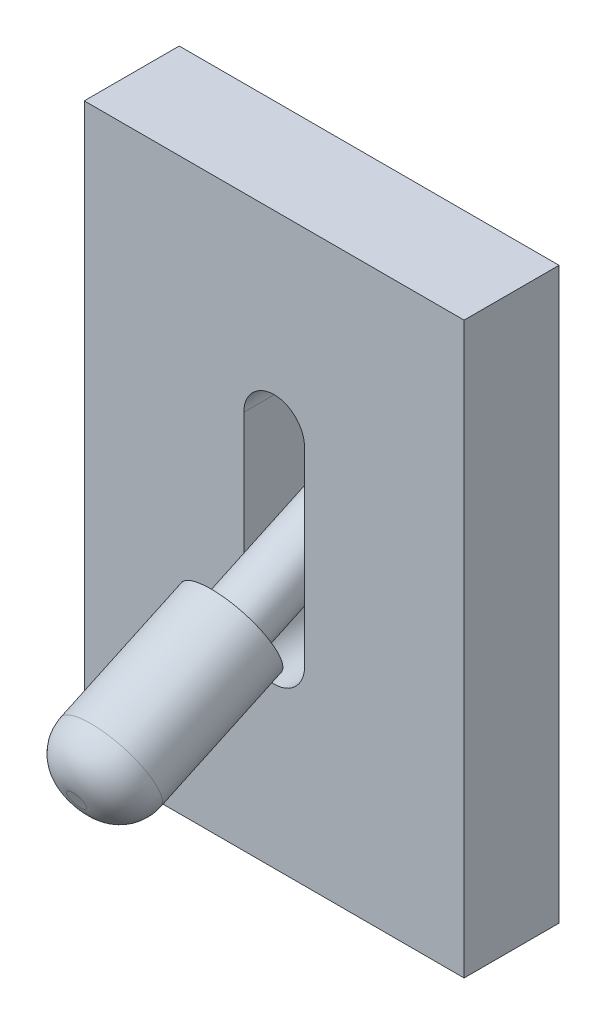
ISO-10303-21;
HEADER;
FILE_DESCRIPTION(('STEP AP214'),'2;1');
FILE_NAME('part.step','',(''),(''),'','','');
FILE_SCHEMA(('AUTOMOTIVE_DESIGN { 1 0 10303 214 1 1 1 1 }'));
ENDSEC;
DATA;
#1=APPLICATION_CONTEXT('core data for automotive mechanical design processes');
#2=APPLICATION_PROTOCOL_DEFINITION('international standard','automotive_design',2000,#1);
#3=PRODUCT_CONTEXT('',#1,'mechanical');
#4=PRODUCT('Part','Part','',(#3));
#5=PRODUCT_RELATED_PRODUCT_CATEGORY('part','',(#4));
#6=PRODUCT_DEFINITION_FORMATION('','',#4);
#7=PRODUCT_DEFINITION_CONTEXT('part definition',#1,'design');
#8=PRODUCT_DEFINITION('design','',#6,#7);
#9=PRODUCT_DEFINITION_SHAPE('','',#8);
#10=(LENGTH_UNIT() NAMED_UNIT(*) SI_UNIT(.MILLI.,.METRE.));
#11=(NAMED_UNIT(*) PLANE_ANGLE_UNIT() SI_UNIT($,.RADIAN.));
#12=(NAMED_UNIT(*) SI_UNIT($,.STERADIAN.) SOLID_ANGLE_UNIT());
#13=UNCERTAINTY_MEASURE_WITH_UNIT(LENGTH_MEASURE(1.E-05),#10,'distance_accuracy_value','');
#14=(GEOMETRIC_REPRESENTATION_CONTEXT(3) GLOBAL_UNCERTAINTY_ASSIGNED_CONTEXT((#13)) GLOBAL_UNIT_ASSIGNED_CONTEXT((#10,
#11,#12)) REPRESENTATION_CONTEXT('',''));
#15=CARTESIAN_POINT('',(0.,0.,0.));
#16=DIRECTION('',(0.,0.,1.));
#17=DIRECTION('',(1.,0.,0.));
#18=AXIS2_PLACEMENT_3D('',#15,#16,#17);
#19=CARTESIAN_POINT('',(-136.,-16.6845104495918,8.40723237962318));
#20=DIRECTION('',(0.,-0.422618261740694,0.906307787036653));
#21=DIRECTION('',(0.,-0.906307787036653,-0.422618261740694));
#22=AXIS2_PLACEMENT_3D('',#19,#20,#21);
#23=PLANE('',#22);
#24=CARTESIAN_POINT('',(-136.,-16.6845104495918,8.40723237962319));
#25=DIRECTION('',(0.,-0.422618261740694,0.906307787036653));
#26=DIRECTION('',(0.,-0.906307787036653,-0.422618261740694));
#27=AXIS2_PLACEMENT_3D('',#24,#25,#26);
#28=CIRCLE('',#27,0.499999999999985);
#29=CARTESIAN_POINT('',(-136.,-17.1376643431101,8.19592324875284));
#30=VERTEX_POINT('',#29);
#31=EDGE_CURVE('E11',#30,#30,#28,.T.);
#32=ORIENTED_EDGE('',*,*,#31,.T.);
#33=EDGE_LOOP('',(#32));
#34=FACE_BOUND('',#33,.T.);
#35=ADVANCED_FACE('F45',(#34),#23,.T.);
#36=CARTESIAN_POINT('',(-136.,-9.49999999999997,-7.00000000000001));
#37=DIRECTION('',(0.,0.422618261740694,-0.906307787036653));
#38=DIRECTION('',(0.,0.906307787036653,0.422618261740694));
#39=AXIS2_PLACEMENT_3D('',#36,#37,#38);
#40=CYLINDRICAL_SURFACE('',#39,2.49999999999999);
#41=CARTESIAN_POINT('',(-136.,-15.8392739261104,6.59461680554987));
#42=DIRECTION('',(0.,-0.422618261740694,0.906307787036653));
#43=DIRECTION('',(0.,-0.906307787036653,-0.422618261740694));
#44=AXIS2_PLACEMENT_3D('',#41,#42,#43);
#45=CIRCLE('',#44,2.49999999999999);
#46=CARTESIAN_POINT('',(-136.,-18.105043393702,5.53807115119814));
#47=VERTEX_POINT('',#46);
#48=EDGE_CURVE('E52',#47,#47,#45,.F.);
#49=ORIENTED_EDGE('',*,*,#48,.T.);
#50=EDGE_LOOP('',(#49));
#51=FACE_BOUND('',#50,.T.);
#52=CARTESIAN_POINT('',(-136.,-12.8809460939255,0.250462296293222));
#53=DIRECTION('',(0.,0.422618261740694,-0.906307787036653));
#54=DIRECTION('',(0.,0.906307787036653,0.422618261740694));
#55=AXIS2_PLACEMENT_3D('',#52,#53,#54);
#56=CIRCLE('',#55,2.49999999999998);
#57=CARTESIAN_POINT('',(-136.,-10.6151766263339,1.30700795064495));
#58=VERTEX_POINT('',#57);
#59=EDGE_CURVE('E56',#58,#58,#56,.T.);
#60=ORIENTED_EDGE('',*,*,#59,.F.);
#61=EDGE_LOOP('',(#60));
#62=FACE_BOUND('',#61,.T.);
#63=ADVANCED_FACE('F81',(#51,#62),#40,.T.);
#64=CARTESIAN_POINT('',(-136.,-10.6151766263339,1.30700795064495));
#65=DIRECTION('',(0.,0.422618261740694,-0.906307787036653));
#66=DIRECTION('',(0.,0.906307787036653,0.422618261740694));
#67=AXIS2_PLACEMENT_3D('',#64,#65,#66);
#68=PLANE('',#67);
#69=ORIENTED_EDGE('',*,*,#59,.T.);
#70=EDGE_LOOP('',(#69));
#71=FACE_BOUND('',#70,.T.);
#72=CARTESIAN_POINT('',(-136.,-12.8809460939255,0.250462296293216));
#73=DIRECTION('',(0.,0.422618261740694,-0.906307787036653));
#74=DIRECTION('',(0.,0.906307787036653,0.422618261740694));
#75=AXIS2_PLACEMENT_3D('',#72,#73,#74);
#76=CIRCLE('',#75,1.49999999999999);
#77=CARTESIAN_POINT('',(-136.,-11.5214844133706,0.884389688904253));
#78=VERTEX_POINT('',#77);
#79=EDGE_CURVE('E60',#78,#78,#76,.T.);
#80=ORIENTED_EDGE('',*,*,#79,.F.);
#81=EDGE_LOOP('',(#80));
#82=FACE_BOUND('',#81,.T.);
#83=ADVANCED_FACE('F73',(#71,#82),#68,.T.);
#84=CARTESIAN_POINT('',(-136.,-9.49999999999997,-7.00000000000001));
#85=DIRECTION('',(0.,0.422618261740694,-0.906307787036653));
#86=DIRECTION('',(0.,0.906307787036653,0.422618261740694));
#87=AXIS2_PLACEMENT_3D('',#84,#85,#86);
#88=CYLINDRICAL_SURFACE('',#87,1.49999999999999);
#89=ORIENTED_EDGE('',*,*,#79,.T.);
#90=EDGE_LOOP('',(#89));
#91=FACE_BOUND('',#90,.T.);
#92=CARTESIAN_POINT('',(-136.,-9.49999999999998,-6.99999999999998));
#93=DIRECTION('',(0.,0.422618261740694,-0.906307787036653));
#94=DIRECTION('',(0.,0.906307787036653,0.422618261740694));
#95=AXIS2_PLACEMENT_3D('',#92,#93,#94);
#96=CIRCLE('',#95,1.49999999999999);
#97=CARTESIAN_POINT('',(-136.,-8.14053831944501,-6.36607260738895));
#98=VERTEX_POINT('',#97);
#99=EDGE_CURVE('E65',#98,#98,#96,.T.);
#100=ORIENTED_EDGE('',*,*,#99,.F.);
#101=EDGE_LOOP('',(#100));
#102=FACE_BOUND('',#101,.T.);
#103=ADVANCED_FACE('F71',(#91,#102),#88,.T.);
#104=CARTESIAN_POINT('',(-136.,-8.140538319445,-6.36607260738896));
#105=DIRECTION('',(0.,0.422618261740694,-0.906307787036653));
#106=DIRECTION('',(0.,0.906307787036653,0.422618261740694));
#107=AXIS2_PLACEMENT_3D('',#104,#105,#106);
#108=PLANE('',#107);
#109=ORIENTED_EDGE('',*,*,#99,.T.);
#110=EDGE_LOOP('',(#109));
#111=FACE_BOUND('',#110,.T.);
#112=ADVANCED_FACE('F69',(#111),#108,.T.);
#113=CARTESIAN_POINT('',(-136.,-15.8392739261104,6.59461680554988));
#114=DIRECTION('',(0.,-0.422618261740694,0.906307787036653));
#115=DIRECTION('',(0.,-0.906307787036653,-0.422618261740694));
#116=AXIS2_PLACEMENT_3D('',#113,#114,#115);
#117=DEGENERATE_TOROIDAL_SURFACE('',#116,0.499999999999985,2.,.T.);
#118=ORIENTED_EDGE('',*,*,#31,.F.);
#119=EDGE_LOOP('',(#118));
#120=FACE_BOUND('',#119,.T.);
#121=ORIENTED_EDGE('',*,*,#48,.F.);
#122=EDGE_LOOP('',(#121));
#123=FACE_BOUND('',#122,.T.);
#124=ADVANCED_FACE('F47',(#120,#123),#117,.T.);
#125=CLOSED_SHELL('',(#35,#63,#83,#103,#112,#124));
#126=MANIFOLD_SOLID_BREP('B2',#125);
#127=CARTESIAN_POINT('',(-126.,-25.,-43.0555127546399));
#128=DIRECTION('',(-1.,0.,0.));
#129=DIRECTION('',(0.,0.,1.));
#130=AXIS2_PLACEMENT_3D('',#127,#128,#129);
#131=PLANE('',#130);
#132=DIRECTION('',(0.,-1.,0.));
#133=VECTOR('',#132,1.);
#134=CARTESIAN_POINT('',(-126.,-25.,-7.));
#135=LINE('',#134,#133);
#136=CARTESIAN_POINT('',(-126.,5.00000000000001,-7.));
#137=VERTEX_POINT('',#136);
#138=CARTESIAN_POINT('',(-126.,-25.,-7.));
#139=VERTEX_POINT('',#138);
#140=EDGE_CURVE('E148',#137,#139,#135,.T.);
#141=ORIENTED_EDGE('',*,*,#140,.F.);
#142=DIRECTION('',(0.,0.,1.));
#143=VECTOR('',#142,1.);
#144=CARTESIAN_POINT('',(-126.,5.00000000000001,-43.0555127546399));
#145=LINE('',#144,#143);
#146=CARTESIAN_POINT('',(-126.,5.00000000000001,-2.));
#147=VERTEX_POINT('',#146);
#148=EDGE_CURVE('E256',#137,#147,#145,.T.);
#149=ORIENTED_EDGE('',*,*,#148,.T.);
#150=DIRECTION('',(0.,-1.,0.));
#151=VECTOR('',#150,1.);
#152=CARTESIAN_POINT('',(-126.,-25.,-2.));
#153=LINE('',#152,#151);
#154=CARTESIAN_POINT('',(-126.,-25.,-2.));
#155=VERTEX_POINT('',#154);
#156=EDGE_CURVE('E210',#147,#155,#153,.T.);
#157=ORIENTED_EDGE('',*,*,#156,.T.);
#158=DIRECTION('',(0.,0.,1.));
#159=VECTOR('',#158,1.);
#160=CARTESIAN_POINT('',(-126.,-25.,-43.0555127546399));
#161=LINE('',#160,#159);
#162=EDGE_CURVE('E242',#139,#155,#161,.T.);
#163=ORIENTED_EDGE('',*,*,#162,.F.);
#164=EDGE_LOOP('',(#141,#149,#157,#163));
#165=FACE_BOUND('',#164,.T.);
#166=ADVANCED_FACE('F141',(#165),#131,.F.);
#167=CARTESIAN_POINT('',(-146.,-25.,-43.0555127546399));
#168=DIRECTION('',(0.,1.,0.));
#169=DIRECTION('',(-1.,0.,0.));
#170=AXIS2_PLACEMENT_3D('',#167,#168,#169);
#171=PLANE('',#170);
#172=DIRECTION('',(-1.,0.,0.));
#173=VECTOR('',#172,1.);
#174=CARTESIAN_POINT('',(-146.,-25.,-7.));
#175=LINE('',#174,#173);
#176=CARTESIAN_POINT('',(-146.,-25.,-7.));
#177=VERTEX_POINT('',#176);
#178=EDGE_CURVE('E241',#139,#177,#175,.T.);
#179=ORIENTED_EDGE('',*,*,#178,.F.);
#180=ORIENTED_EDGE('',*,*,#162,.T.);
#181=DIRECTION('',(-1.,0.,0.));
#182=VECTOR('',#181,1.);
#183=CARTESIAN_POINT('',(-146.,-25.,-2.));
#184=LINE('',#183,#182);
#185=CARTESIAN_POINT('',(-146.,-25.,-2.));
#186=VERTEX_POINT('',#185);
#187=EDGE_CURVE('E247',#155,#186,#184,.T.);
#188=ORIENTED_EDGE('',*,*,#187,.T.);
#189=DIRECTION('',(0.,0.,1.));
#190=VECTOR('',#189,1.);
#191=CARTESIAN_POINT('',(-146.,-25.,-43.0555127546399));
#192=LINE('',#191,#190);
#193=EDGE_CURVE('E260',#177,#186,#192,.T.);
#194=ORIENTED_EDGE('',*,*,#193,.F.);
#195=EDGE_LOOP('',(#179,#180,#188,#194));
#196=FACE_BOUND('',#195,.T.);
#197=ADVANCED_FACE('F265',(#196),#171,.F.);
#198=CARTESIAN_POINT('',(-146.,-25.,-43.0555127546399));
#199=DIRECTION('',(1.,0.,0.));
#200=DIRECTION('',(0.,0.,-1.));
#201=AXIS2_PLACEMENT_3D('',#198,#199,#200);
#202=PLANE('',#201);
#203=DIRECTION('',(0.,1.,0.));
#204=VECTOR('',#203,1.);
#205=CARTESIAN_POINT('',(-146.,-25.,-7.));
#206=LINE('',#205,#204);
#207=CARTESIAN_POINT('',(-146.,5.00000000000001,-7.));
#208=VERTEX_POINT('',#207);
#209=EDGE_CURVE('E239',#177,#208,#206,.T.);
#210=ORIENTED_EDGE('',*,*,#209,.F.);
#211=ORIENTED_EDGE('',*,*,#193,.T.);
#212=DIRECTION('',(0.,1.,0.));
#213=VECTOR('',#212,1.);
#214=CARTESIAN_POINT('',(-146.,-25.,-2.));
#215=LINE('',#214,#213);
#216=CARTESIAN_POINT('',(-146.,5.00000000000001,-2.));
#217=VERTEX_POINT('',#216);
#218=EDGE_CURVE('E250',#186,#217,#215,.T.);
#219=ORIENTED_EDGE('',*,*,#218,.T.);
#220=DIRECTION('',(0.,0.,1.));
#221=VECTOR('',#220,1.);
#222=CARTESIAN_POINT('',(-146.,5.00000000000001,-43.0555127546399));
#223=LINE('',#222,#221);
#224=EDGE_CURVE('E258',#208,#217,#223,.T.);
#225=ORIENTED_EDGE('',*,*,#224,.F.);
#226=EDGE_LOOP('',(#210,#211,#219,#225));
#227=FACE_BOUND('',#226,.T.);
#228=ADVANCED_FACE('F281',(#227),#202,.F.);
#229=CARTESIAN_POINT('',(-146.,5.00000000000001,-43.0555127546399));
#230=DIRECTION('',(0.,-1.,0.));
#231=DIRECTION('',(1.,0.,0.));
#232=AXIS2_PLACEMENT_3D('',#229,#230,#231);
#233=PLANE('',#232);
#234=DIRECTION('',(1.,0.,0.));
#235=VECTOR('',#234,1.);
#236=CARTESIAN_POINT('',(-146.,5.00000000000001,-7.));
#237=LINE('',#236,#235);
#238=EDGE_CURVE('E43',#208,#137,#237,.T.);
#239=ORIENTED_EDGE('',*,*,#238,.F.);
#240=ORIENTED_EDGE('',*,*,#224,.T.);
#241=DIRECTION('',(1.,0.,0.));
#242=VECTOR('',#241,1.);
#243=CARTESIAN_POINT('',(-146.,5.00000000000001,-2.));
#244=LINE('',#243,#242);
#245=EDGE_CURVE('E253',#217,#147,#244,.T.);
#246=ORIENTED_EDGE('',*,*,#245,.T.);
#247=ORIENTED_EDGE('',*,*,#148,.F.);
#248=EDGE_LOOP('',(#239,#240,#246,#247));
#249=FACE_BOUND('',#248,.T.);
#250=ADVANCED_FACE('F277',(#249),#233,.F.);
#251=CARTESIAN_POINT('',(0.,0.,-2.));
#252=DIRECTION('',(0.,0.,-1.));
#253=DIRECTION('',(-1.,0.,0.));
#254=AXIS2_PLACEMENT_3D('',#251,#252,#253);
#255=PLANE('',#254);
#256=DIRECTION('',(0.,-1.,0.));
#257=VECTOR('',#256,1.);
#258=CARTESIAN_POINT('',(-137.6,-4.99999999999999,-2.));
#259=LINE('',#258,#257);
#260=CARTESIAN_POINT('',(-137.6,-4.99999999999999,-2.));
#261=VERTEX_POINT('',#260);
#262=CARTESIAN_POINT('',(-137.6,-15.,-2.));
#263=VERTEX_POINT('',#262);
#264=EDGE_CURVE('E223',#261,#263,#259,.T.);
#265=ORIENTED_EDGE('',*,*,#264,.F.);
#266=CARTESIAN_POINT('',(-136.,-4.99999999999999,-2.));
#267=DIRECTION('',(0.,0.,1.));
#268=DIRECTION('',(1.,0.,0.));
#269=AXIS2_PLACEMENT_3D('',#266,#267,#268);
#270=CIRCLE('',#269,1.59999999999999);
#271=CARTESIAN_POINT('',(-134.4,-4.99999999999999,-2.));
#272=VERTEX_POINT('',#271);
#273=EDGE_CURVE('E155',#272,#261,#270,.T.);
#274=ORIENTED_EDGE('',*,*,#273,.F.);
#275=DIRECTION('',(0.,1.,0.));
#276=VECTOR('',#275,1.);
#277=CARTESIAN_POINT('',(-134.4,-4.99999999999999,-2.));
#278=LINE('',#277,#276);
#279=CARTESIAN_POINT('',(-134.4,-15.,-2.));
#280=VERTEX_POINT('',#279);
#281=EDGE_CURVE('E216',#280,#272,#278,.T.);
#282=ORIENTED_EDGE('',*,*,#281,.F.);
#283=CARTESIAN_POINT('',(-136.,-15.,-2.));
#284=DIRECTION('',(0.,0.,1.));
#285=DIRECTION('',(1.,0.,0.));
#286=AXIS2_PLACEMENT_3D('',#283,#284,#285);
#287=CIRCLE('',#286,1.59999999999999);
#288=EDGE_CURVE('E230',#263,#280,#287,.T.);
#289=ORIENTED_EDGE('',*,*,#288,.F.);
#290=EDGE_LOOP('',(#265,#274,#282,#289));
#291=FACE_BOUND('',#290,.T.);
#292=ORIENTED_EDGE('',*,*,#156,.F.);
#293=ORIENTED_EDGE('',*,*,#245,.F.);
#294=ORIENTED_EDGE('',*,*,#218,.F.);
#295=ORIENTED_EDGE('',*,*,#187,.F.);
#296=EDGE_LOOP('',(#292,#293,#294,#295));
#297=FACE_BOUND('',#296,.T.);
#298=ADVANCED_FACE('F272',(#291,#297),#255,.F.);
#299=CARTESIAN_POINT('',(0.,0.,-7.));
#300=DIRECTION('',(0.,0.,-1.));
#301=DIRECTION('',(-1.,0.,0.));
#302=AXIS2_PLACEMENT_3D('',#299,#300,#301);
#303=PLANE('',#302);
#304=CARTESIAN_POINT('',(-136.,-4.99999999999999,-7.));
#305=DIRECTION('',(0.,0.,-1.));
#306=DIRECTION('',(-1.,0.,0.));
#307=AXIS2_PLACEMENT_3D('',#304,#305,#306);
#308=CIRCLE('',#307,1.59999999999999);
#309=CARTESIAN_POINT('',(-134.4,-4.99999999999999,-7.));
#310=VERTEX_POINT('',#309);
#311=CARTESIAN_POINT('',(-137.6,-4.99999999999999,-7.));
#312=VERTEX_POINT('',#311);
#313=EDGE_CURVE('E214',#310,#312,#308,.F.);
#314=ORIENTED_EDGE('',*,*,#313,.T.);
#315=DIRECTION('',(0.,-1.,0.));
#316=VECTOR('',#315,1.);
#317=CARTESIAN_POINT('',(-137.6,-4.99999999999999,-7.));
#318=LINE('',#317,#316);
#319=CARTESIAN_POINT('',(-137.6,-15.,-7.));
#320=VERTEX_POINT('',#319);
#321=EDGE_CURVE('E203',#312,#320,#318,.T.);
#322=ORIENTED_EDGE('',*,*,#321,.T.);
#323=CARTESIAN_POINT('',(-136.,-15.,-7.));
#324=DIRECTION('',(0.,0.,-1.));
#325=DIRECTION('',(-1.,0.,0.));
#326=AXIS2_PLACEMENT_3D('',#323,#324,#325);
#327=CIRCLE('',#326,1.59999999999999);
#328=CARTESIAN_POINT('',(-134.4,-15.,-7.));
#329=VERTEX_POINT('',#328);
#330=EDGE_CURVE('E225',#320,#329,#327,.F.);
#331=ORIENTED_EDGE('',*,*,#330,.T.);
#332=DIRECTION('',(0.,1.,0.));
#333=VECTOR('',#332,1.);
#334=CARTESIAN_POINT('',(-134.4,-4.99999999999999,-7.));
#335=LINE('',#334,#333);
#336=EDGE_CURVE('E221',#329,#310,#335,.T.);
#337=ORIENTED_EDGE('',*,*,#336,.T.);
#338=EDGE_LOOP('',(#314,#322,#331,#337));
#339=FACE_BOUND('',#338,.T.);
#340=ORIENTED_EDGE('',*,*,#140,.T.);
#341=ORIENTED_EDGE('',*,*,#178,.T.);
#342=ORIENTED_EDGE('',*,*,#209,.T.);
#343=ORIENTED_EDGE('',*,*,#238,.T.);
#344=EDGE_LOOP('',(#340,#341,#342,#343));
#345=FACE_BOUND('',#344,.T.);
#346=ADVANCED_FACE('F219',(#339,#345),#303,.T.);
#347=CARTESIAN_POINT('',(-136.,-4.99999999999999,-7.001));
#348=DIRECTION('',(0.,0.,1.));
#349=DIRECTION('',(1.,0.,0.));
#350=AXIS2_PLACEMENT_3D('',#347,#348,#349);
#351=CYLINDRICAL_SURFACE('',#350,1.59999999999999);
#352=DIRECTION('',(0.,0.,1.));
#353=VECTOR('',#352,1.);
#354=CARTESIAN_POINT('',(-134.4,-4.99999999999999,-7.001));
#355=LINE('',#354,#353);
#356=EDGE_CURVE('E211',#310,#272,#355,.T.);
#357=ORIENTED_EDGE('',*,*,#356,.T.);
#358=ORIENTED_EDGE('',*,*,#273,.T.);
#359=DIRECTION('',(0.,0.,1.));
#360=VECTOR('',#359,1.);
#361=CARTESIAN_POINT('',(-137.6,-4.99999999999999,-7.001));
#362=LINE('',#361,#360);
#363=EDGE_CURVE('E205',#312,#261,#362,.T.);
#364=ORIENTED_EDGE('',*,*,#363,.F.);
#365=ORIENTED_EDGE('',*,*,#313,.F.);
#366=EDGE_LOOP('',(#357,#358,#364,#365));
#367=FACE_BOUND('',#366,.T.);
#368=ADVANCED_FACE('F213',(#367),#351,.F.);
#369=CARTESIAN_POINT('',(-134.4,-4.99999999999999,-7.001));
#370=DIRECTION('',(1.,0.,0.));
#371=DIRECTION('',(0.,0.,-1.));
#372=AXIS2_PLACEMENT_3D('',#369,#370,#371);
#373=PLANE('',#372);
#374=DIRECTION('',(0.,0.,1.));
#375=VECTOR('',#374,1.);
#376=CARTESIAN_POINT('',(-134.4,-15.,-7.001));
#377=LINE('',#376,#375);
#378=EDGE_CURVE('E236',#329,#280,#377,.T.);
#379=ORIENTED_EDGE('',*,*,#378,.T.);
#380=ORIENTED_EDGE('',*,*,#281,.T.);
#381=ORIENTED_EDGE('',*,*,#356,.F.);
#382=ORIENTED_EDGE('',*,*,#336,.F.);
#383=EDGE_LOOP('',(#379,#380,#381,#382));
#384=FACE_BOUND('',#383,.T.);
#385=ADVANCED_FACE('F288',(#384),#373,.F.);
#386=CARTESIAN_POINT('',(-136.,-15.,-7.001));
#387=DIRECTION('',(0.,0.,1.));
#388=DIRECTION('',(1.,0.,0.));
#389=AXIS2_PLACEMENT_3D('',#386,#387,#388);
#390=CYLINDRICAL_SURFACE('',#389,1.59999999999999);
#391=DIRECTION('',(0.,0.,1.));
#392=VECTOR('',#391,1.);
#393=CARTESIAN_POINT('',(-137.6,-15.,-7.001));
#394=LINE('',#393,#392);
#395=EDGE_CURVE('E163',#320,#263,#394,.T.);
#396=ORIENTED_EDGE('',*,*,#395,.T.);
#397=ORIENTED_EDGE('',*,*,#288,.T.);
#398=ORIENTED_EDGE('',*,*,#378,.F.);
#399=ORIENTED_EDGE('',*,*,#330,.F.);
#400=EDGE_LOOP('',(#396,#397,#398,#399));
#401=FACE_BOUND('',#400,.T.);
#402=ADVANCED_FACE('F332',(#401),#390,.F.);
#403=CARTESIAN_POINT('',(-137.6,-4.99999999999999,-7.001));
#404=DIRECTION('',(-1.,0.,0.));
#405=DIRECTION('',(0.,0.,1.));
#406=AXIS2_PLACEMENT_3D('',#403,#404,#405);
#407=PLANE('',#406);
#408=ORIENTED_EDGE('',*,*,#363,.T.);
#409=ORIENTED_EDGE('',*,*,#264,.T.);
#410=ORIENTED_EDGE('',*,*,#395,.F.);
#411=ORIENTED_EDGE('',*,*,#321,.F.);
#412=EDGE_LOOP('',(#408,#409,#410,#411));
#413=FACE_BOUND('',#412,.T.);
#414=ADVANCED_FACE('F204',(#413),#407,.F.);
#415=CLOSED_SHELL('',(#166,#197,#228,#250,#298,#346,#368,#385,#402,#414));
#416=MANIFOLD_SOLID_BREP('B6',#415);
#417=ADVANCED_BREP_SHAPE_REPRESENTATION('',(#18,#126,#416),#14);
#418=SHAPE_DEFINITION_REPRESENTATION(#9,#417);
ENDSEC;
END-ISO-10303-21;
